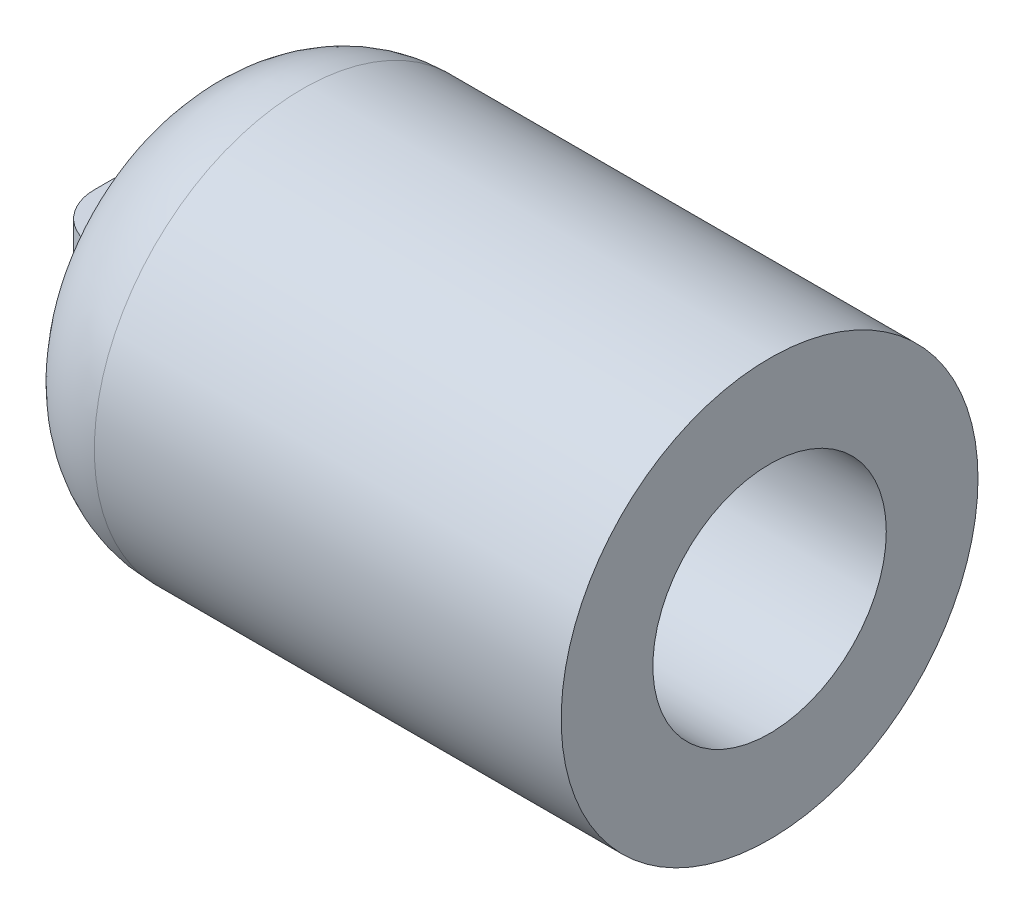
ISO-10303-21;
HEADER;
FILE_DESCRIPTION(('STEP AP214'),'2;1');
FILE_NAME('part.step','',(''),(''),'','','');
FILE_SCHEMA(('AUTOMOTIVE_DESIGN { 1 0 10303 214 1 1 1 1 }'));
ENDSEC;
DATA;
#1=APPLICATION_CONTEXT('core data for automotive mechanical design processes');
#2=APPLICATION_PROTOCOL_DEFINITION('international standard','automotive_design',2000,#1);
#3=PRODUCT_CONTEXT('',#1,'mechanical');
#4=PRODUCT('Part','Part','',(#3));
#5=PRODUCT_RELATED_PRODUCT_CATEGORY('part','',(#4));
#6=PRODUCT_DEFINITION_FORMATION('','',#4);
#7=PRODUCT_DEFINITION_CONTEXT('part definition',#1,'design');
#8=PRODUCT_DEFINITION('design','',#6,#7);
#9=PRODUCT_DEFINITION_SHAPE('','',#8);
#10=(LENGTH_UNIT() NAMED_UNIT(*) SI_UNIT(.MILLI.,.METRE.));
#11=(NAMED_UNIT(*) PLANE_ANGLE_UNIT() SI_UNIT($,.RADIAN.));
#12=(NAMED_UNIT(*) SI_UNIT($,.STERADIAN.) SOLID_ANGLE_UNIT());
#13=UNCERTAINTY_MEASURE_WITH_UNIT(LENGTH_MEASURE(1.E-05),#10,'distance_accuracy_value','');
#14=(GEOMETRIC_REPRESENTATION_CONTEXT(3) GLOBAL_UNCERTAINTY_ASSIGNED_CONTEXT((#13)) GLOBAL_UNIT_ASSIGNED_CONTEXT((#10,
#11,#12)) REPRESENTATION_CONTEXT('',''));
#15=CARTESIAN_POINT('',(0.,0.,0.));
#16=DIRECTION('',(0.,0.,1.));
#17=DIRECTION('',(1.,0.,0.));
#18=AXIS2_PLACEMENT_3D('',#15,#16,#17);
#19=CARTESIAN_POINT('',(-35.,0.,0.));
#20=DIRECTION('',(1.,0.,0.));
#21=DIRECTION('',(0.,0.,-1.));
#22=AXIS2_PLACEMENT_3D('',#19,#20,#21);
#23=CYLINDRICAL_SURFACE('',#22,12.5);
#24=CARTESIAN_POINT('',(-28.,0.,0.));
#25=DIRECTION('',(1.,0.,0.));
#26=DIRECTION('',(0.,0.,-1.));
#27=AXIS2_PLACEMENT_3D('',#24,#25,#26);
#28=CIRCLE('',#27,12.5);
#29=CARTESIAN_POINT('',(-28.,0.,-12.5));
#30=VERTEX_POINT('',#29);
#31=EDGE_CURVE('E49',#30,#30,#28,.T.);
#32=ORIENTED_EDGE('',*,*,#31,.T.);
#33=EDGE_LOOP('',(#32));
#34=FACE_BOUND('',#33,.T.);
#35=CARTESIAN_POINT('',(0.,0.,0.));
#36=DIRECTION('',(1.,0.,0.));
#37=DIRECTION('',(0.,0.,-1.));
#38=AXIS2_PLACEMENT_3D('',#35,#36,#37);
#39=CIRCLE('',#38,12.5);
#40=CARTESIAN_POINT('',(0.,0.,-12.5));
#41=VERTEX_POINT('',#40);
#42=EDGE_CURVE('E133',#41,#41,#39,.T.);
#43=ORIENTED_EDGE('',*,*,#42,.F.);
#44=EDGE_LOOP('',(#43));
#45=FACE_BOUND('',#44,.T.);
#46=ADVANCED_FACE('F40',(#34,#45),#23,.T.);
#47=CARTESIAN_POINT('',(-35.,0.,0.));
#48=DIRECTION('',(1.,0.,0.));
#49=DIRECTION('',(0.,0.,-1.));
#50=AXIS2_PLACEMENT_3D('',#47,#48,#49);
#51=PLANE('',#50);
#52=CARTESIAN_POINT('',(-35.,0.,0.));
#53=DIRECTION('',(1.,0.,0.));
#54=DIRECTION('',(0.,0.,-1.));
#55=AXIS2_PLACEMENT_3D('',#52,#53,#54);
#56=CIRCLE('',#55,5.5);
#57=CARTESIAN_POINT('',(-35.,0.,-5.5));
#58=VERTEX_POINT('',#57);
#59=EDGE_CURVE('E11',#58,#58,#56,.F.);
#60=ORIENTED_EDGE('',*,*,#59,.T.);
#61=EDGE_LOOP('',(#60));
#62=FACE_BOUND('',#61,.T.);
#63=DIRECTION('',(0.,-1.,0.));
#64=VECTOR('',#63,1.);
#65=CARTESIAN_POINT('',(-35.,1.5,3.5));
#66=LINE('',#65,#64);
#67=CARTESIAN_POINT('',(-35.,1.5,3.5));
#68=VERTEX_POINT('',#67);
#69=CARTESIAN_POINT('',(-35.,-1.5,3.5));
#70=VERTEX_POINT('',#69);
#71=EDGE_CURVE('E114',#68,#70,#66,.T.);
#72=ORIENTED_EDGE('',*,*,#71,.T.);
#73=DIRECTION('',(0.,0.,-1.));
#74=VECTOR('',#73,1.);
#75=CARTESIAN_POINT('',(-35.,-1.5,3.5));
#76=LINE('',#75,#74);
#77=CARTESIAN_POINT('',(-35.,-1.5,-3.5));
#78=VERTEX_POINT('',#77);
#79=EDGE_CURVE('E97',#70,#78,#76,.T.);
#80=ORIENTED_EDGE('',*,*,#79,.T.);
#81=DIRECTION('',(0.,-1.,0.));
#82=VECTOR('',#81,1.);
#83=CARTESIAN_POINT('',(-35.,1.5,-3.5));
#84=LINE('',#83,#82);
#85=CARTESIAN_POINT('',(-35.,1.5,-3.5));
#86=VERTEX_POINT('',#85);
#87=EDGE_CURVE('E104',#86,#78,#84,.T.);
#88=ORIENTED_EDGE('',*,*,#87,.F.);
#89=DIRECTION('',(0.,0.,-1.));
#90=VECTOR('',#89,1.);
#91=CARTESIAN_POINT('',(-35.,1.5,3.5));
#92=LINE('',#91,#90);
#93=EDGE_CURVE('E110',#68,#86,#92,.T.);
#94=ORIENTED_EDGE('',*,*,#93,.F.);
#95=EDGE_LOOP('',(#72,#80,#88,#94));
#96=FACE_BOUND('',#95,.T.);
#97=ADVANCED_FACE('F112',(#62,#96),#51,.F.);
#98=CARTESIAN_POINT('',(0.,0.,0.));
#99=DIRECTION('',(1.,0.,0.));
#100=DIRECTION('',(0.,0.,-1.));
#101=AXIS2_PLACEMENT_3D('',#98,#99,#100);
#102=PLANE('',#101);
#103=CARTESIAN_POINT('',(0.,0.,0.));
#104=DIRECTION('',(1.,0.,0.));
#105=DIRECTION('',(0.,0.,-1.));
#106=AXIS2_PLACEMENT_3D('',#103,#104,#105);
#107=CIRCLE('',#106,7.);
#108=CARTESIAN_POINT('',(0.,0.,-7.));
#109=VERTEX_POINT('',#108);
#110=EDGE_CURVE('E228',#109,#109,#107,.T.);
#111=ORIENTED_EDGE('',*,*,#110,.F.);
#112=EDGE_LOOP('',(#111));
#113=FACE_BOUND('',#112,.T.);
#114=ORIENTED_EDGE('',*,*,#42,.T.);
#115=EDGE_LOOP('',(#114));
#116=FACE_BOUND('',#115,.T.);
#117=ADVANCED_FACE('F193',(#113,#116),#102,.T.);
#118=CARTESIAN_POINT('',(-40.,-1.5,3.5));
#119=DIRECTION('',(0.,-1.,0.));
#120=DIRECTION('',(0.,0.,-1.));
#121=AXIS2_PLACEMENT_3D('',#118,#119,#120);
#122=PLANE('',#121);
#123=CARTESIAN_POINT('',(-37.5,-1.5,0.));
#124=DIRECTION('',(0.,-1.,0.));
#125=DIRECTION('',(0.,0.,-1.));
#126=AXIS2_PLACEMENT_3D('',#123,#124,#125);
#127=CIRCLE('',#126,1.5);
#128=CARTESIAN_POINT('',(-37.5,-1.5,-1.5));
#129=VERTEX_POINT('',#128);
#130=EDGE_CURVE('E120',#129,#129,#127,.T.);
#131=ORIENTED_EDGE('',*,*,#130,.F.);
#132=EDGE_LOOP('',(#131));
#133=FACE_BOUND('',#132,.T.);
#134=DIRECTION('',(0.,0.,-1.));
#135=VECTOR('',#134,1.);
#136=CARTESIAN_POINT('',(-40.,-1.5,3.5));
#137=LINE('',#136,#135);
#138=CARTESIAN_POINT('',(-40.,-1.5,0.5));
#139=VERTEX_POINT('',#138);
#140=CARTESIAN_POINT('',(-40.,-1.5,-0.5));
#141=VERTEX_POINT('',#140);
#142=EDGE_CURVE('E129',#139,#141,#137,.T.);
#143=ORIENTED_EDGE('',*,*,#142,.T.);
#144=CARTESIAN_POINT('',(-37.,-1.5,-0.5));
#145=DIRECTION('',(0.,-1.,0.));
#146=DIRECTION('',(0.,0.,-1.));
#147=AXIS2_PLACEMENT_3D('',#144,#145,#146);
#148=CIRCLE('',#147,3.);
#149=CARTESIAN_POINT('',(-37.,-1.5,-3.5));
#150=VERTEX_POINT('',#149);
#151=EDGE_CURVE('E64',#141,#150,#148,.T.);
#152=ORIENTED_EDGE('',*,*,#151,.T.);
#153=DIRECTION('',(1.,0.,0.));
#154=VECTOR('',#153,1.);
#155=CARTESIAN_POINT('',(-40.,-1.5,-3.5));
#156=LINE('',#155,#154);
#157=EDGE_CURVE('E92',#150,#78,#156,.T.);
#158=ORIENTED_EDGE('',*,*,#157,.T.);
#159=ORIENTED_EDGE('',*,*,#79,.F.);
#160=DIRECTION('',(1.,0.,0.));
#161=VECTOR('',#160,1.);
#162=CARTESIAN_POINT('',(-40.,-1.5,3.5));
#163=LINE('',#162,#161);
#164=CARTESIAN_POINT('',(-37.,-1.5,3.5));
#165=VERTEX_POINT('',#164);
#166=EDGE_CURVE('E130',#165,#70,#163,.T.);
#167=ORIENTED_EDGE('',*,*,#166,.F.);
#168=CARTESIAN_POINT('',(-37.,-1.5,0.5));
#169=DIRECTION('',(0.,-1.,0.));
#170=DIRECTION('',(0.,0.,-1.));
#171=AXIS2_PLACEMENT_3D('',#168,#169,#170);
#172=CIRCLE('',#171,3.);
#173=EDGE_CURVE('E146',#165,#139,#172,.T.);
#174=ORIENTED_EDGE('',*,*,#173,.T.);
#175=EDGE_LOOP('',(#143,#152,#158,#159,#167,#174));
#176=FACE_BOUND('',#175,.T.);
#177=ADVANCED_FACE('F94',(#133,#176),#122,.T.);
#178=CARTESIAN_POINT('',(-40.,1.5,3.5));
#179=DIRECTION('',(0.,0.,1.));
#180=DIRECTION('',(1.,0.,0.));
#181=AXIS2_PLACEMENT_3D('',#178,#179,#180);
#182=PLANE('',#181);
#183=DIRECTION('',(1.,0.,0.));
#184=VECTOR('',#183,1.);
#185=CARTESIAN_POINT('',(-40.,1.5,3.5));
#186=LINE('',#185,#184);
#187=CARTESIAN_POINT('',(-37.,1.5,3.5));
#188=VERTEX_POINT('',#187);
#189=EDGE_CURVE('E134',#188,#68,#186,.T.);
#190=ORIENTED_EDGE('',*,*,#189,.F.);
#191=DIRECTION('',(0.,-1.,0.));
#192=VECTOR('',#191,1.);
#193=CARTESIAN_POINT('',(-37.,1.5,3.5));
#194=LINE('',#193,#192);
#195=EDGE_CURVE('E141',#188,#165,#194,.T.);
#196=ORIENTED_EDGE('',*,*,#195,.T.);
#197=ORIENTED_EDGE('',*,*,#166,.T.);
#198=ORIENTED_EDGE('',*,*,#71,.F.);
#199=EDGE_LOOP('',(#190,#196,#197,#198));
#200=FACE_BOUND('',#199,.T.);
#201=ADVANCED_FACE('F216',(#200),#182,.T.);
#202=CARTESIAN_POINT('',(-40.,1.5,3.5));
#203=DIRECTION('',(0.,-1.,0.));
#204=DIRECTION('',(0.,0.,-1.));
#205=AXIS2_PLACEMENT_3D('',#202,#203,#204);
#206=PLANE('',#205);
#207=CARTESIAN_POINT('',(-37.5,1.5,0.));
#208=DIRECTION('',(0.,-1.,0.));
#209=DIRECTION('',(0.,0.,-1.));
#210=AXIS2_PLACEMENT_3D('',#207,#208,#209);
#211=CIRCLE('',#210,1.5);
#212=CARTESIAN_POINT('',(-37.5,1.5,-1.5));
#213=VERTEX_POINT('',#212);
#214=EDGE_CURVE('E116',#213,#213,#211,.T.);
#215=ORIENTED_EDGE('',*,*,#214,.T.);
#216=EDGE_LOOP('',(#215));
#217=FACE_BOUND('',#216,.T.);
#218=DIRECTION('',(1.,0.,0.));
#219=VECTOR('',#218,1.);
#220=CARTESIAN_POINT('',(-40.,1.5,-3.5));
#221=LINE('',#220,#219);
#222=CARTESIAN_POINT('',(-37.,1.5,-3.5));
#223=VERTEX_POINT('',#222);
#224=EDGE_CURVE('E100',#223,#86,#221,.T.);
#225=ORIENTED_EDGE('',*,*,#224,.F.);
#226=CARTESIAN_POINT('',(-37.,1.5,-0.5));
#227=DIRECTION('',(0.,-1.,0.));
#228=DIRECTION('',(0.,0.,-1.));
#229=AXIS2_PLACEMENT_3D('',#226,#227,#228);
#230=CIRCLE('',#229,3.);
#231=CARTESIAN_POINT('',(-40.,1.5,-0.5));
#232=VERTEX_POINT('',#231);
#233=EDGE_CURVE('E163',#223,#232,#230,.F.);
#234=ORIENTED_EDGE('',*,*,#233,.T.);
#235=DIRECTION('',(0.,0.,-1.));
#236=VECTOR('',#235,1.);
#237=CARTESIAN_POINT('',(-40.,1.5,3.5));
#238=LINE('',#237,#236);
#239=CARTESIAN_POINT('',(-40.,1.5,0.5));
#240=VERTEX_POINT('',#239);
#241=EDGE_CURVE('E101',#240,#232,#238,.T.);
#242=ORIENTED_EDGE('',*,*,#241,.F.);
#243=CARTESIAN_POINT('',(-37.,1.5,0.5));
#244=DIRECTION('',(0.,-1.,0.));
#245=DIRECTION('',(0.,0.,-1.));
#246=AXIS2_PLACEMENT_3D('',#243,#244,#245);
#247=CIRCLE('',#246,3.);
#248=EDGE_CURVE('E152',#240,#188,#247,.F.);
#249=ORIENTED_EDGE('',*,*,#248,.T.);
#250=ORIENTED_EDGE('',*,*,#189,.T.);
#251=ORIENTED_EDGE('',*,*,#93,.T.);
#252=EDGE_LOOP('',(#225,#234,#242,#249,#250,#251));
#253=FACE_BOUND('',#252,.T.);
#254=ADVANCED_FACE('F213',(#217,#253),#206,.F.);
#255=CARTESIAN_POINT('',(-40.,1.5,-3.5));
#256=DIRECTION('',(0.,0.,1.));
#257=DIRECTION('',(0.,-1.,0.));
#258=AXIS2_PLACEMENT_3D('',#255,#256,#257);
#259=PLANE('',#258);
#260=ORIENTED_EDGE('',*,*,#157,.F.);
#261=DIRECTION('',(0.,-1.,0.));
#262=VECTOR('',#261,1.);
#263=CARTESIAN_POINT('',(-37.,1.5,-3.5));
#264=LINE('',#263,#262);
#265=EDGE_CURVE('E56',#150,#223,#264,.F.);
#266=ORIENTED_EDGE('',*,*,#265,.T.);
#267=ORIENTED_EDGE('',*,*,#224,.T.);
#268=ORIENTED_EDGE('',*,*,#87,.T.);
#269=EDGE_LOOP('',(#260,#266,#267,#268));
#270=FACE_BOUND('',#269,.T.);
#271=ADVANCED_FACE('F105',(#270),#259,.F.);
#272=CARTESIAN_POINT('',(-40.,0.,0.));
#273=DIRECTION('',(-1.,0.,0.));
#274=DIRECTION('',(0.,0.,1.));
#275=AXIS2_PLACEMENT_3D('',#272,#273,#274);
#276=PLANE('',#275);
#277=ORIENTED_EDGE('',*,*,#241,.T.);
#278=DIRECTION('',(0.,-1.,0.));
#279=VECTOR('',#278,1.);
#280=CARTESIAN_POINT('',(-40.,-1.5,-0.5));
#281=LINE('',#280,#279);
#282=EDGE_CURVE('E155',#232,#141,#281,.T.);
#283=ORIENTED_EDGE('',*,*,#282,.T.);
#284=ORIENTED_EDGE('',*,*,#142,.F.);
#285=DIRECTION('',(0.,-1.,0.));
#286=VECTOR('',#285,1.);
#287=CARTESIAN_POINT('',(-40.,0.,0.5));
#288=LINE('',#287,#286);
#289=EDGE_CURVE('E149',#139,#240,#288,.F.);
#290=ORIENTED_EDGE('',*,*,#289,.T.);
#291=EDGE_LOOP('',(#277,#283,#284,#290));
#292=FACE_BOUND('',#291,.T.);
#293=ADVANCED_FACE('F204',(#292),#276,.T.);
#294=CARTESIAN_POINT('',(-37.5,3.5,0.));
#295=DIRECTION('',(0.,-1.,0.));
#296=DIRECTION('',(0.,0.,-1.));
#297=AXIS2_PLACEMENT_3D('',#294,#295,#296);
#298=CYLINDRICAL_SURFACE('',#297,1.5);
#299=ORIENTED_EDGE('',*,*,#130,.T.);
#300=EDGE_LOOP('',(#299));
#301=FACE_BOUND('',#300,.T.);
#302=ORIENTED_EDGE('',*,*,#214,.F.);
#303=EDGE_LOOP('',(#302));
#304=FACE_BOUND('',#303,.T.);
#305=ADVANCED_FACE('F199',(#301,#304),#298,.F.);
#306=CARTESIAN_POINT('',(-37.,1.5,0.5));
#307=DIRECTION('',(0.,-1.,0.));
#308=DIRECTION('',(0.,0.,-1.));
#309=AXIS2_PLACEMENT_3D('',#306,#307,#308);
#310=CYLINDRICAL_SURFACE('',#309,3.);
#311=ORIENTED_EDGE('',*,*,#248,.F.);
#312=ORIENTED_EDGE('',*,*,#289,.F.);
#313=ORIENTED_EDGE('',*,*,#173,.F.);
#314=ORIENTED_EDGE('',*,*,#195,.F.);
#315=EDGE_LOOP('',(#311,#312,#313,#314));
#316=FACE_BOUND('',#315,.T.);
#317=ADVANCED_FACE('F184',(#316),#310,.T.);
#318=CARTESIAN_POINT('',(-37.,0.,-0.5));
#319=DIRECTION('',(0.,1.,0.));
#320=DIRECTION('',(0.,0.,1.));
#321=AXIS2_PLACEMENT_3D('',#318,#319,#320);
#322=CYLINDRICAL_SURFACE('',#321,3.);
#323=ORIENTED_EDGE('',*,*,#233,.F.);
#324=ORIENTED_EDGE('',*,*,#265,.F.);
#325=ORIENTED_EDGE('',*,*,#151,.F.);
#326=ORIENTED_EDGE('',*,*,#282,.F.);
#327=EDGE_LOOP('',(#323,#324,#325,#326));
#328=FACE_BOUND('',#327,.T.);
#329=ADVANCED_FACE('F173',(#328),#322,.T.);
#330=CARTESIAN_POINT('',(-28.,0.,0.));
#331=DIRECTION('',(1.,0.,0.));
#332=DIRECTION('',(0.,0.,-1.));
#333=AXIS2_PLACEMENT_3D('',#330,#331,#332);
#334=DEGENERATE_TOROIDAL_SURFACE('',#333,5.5,7.,.T.);
#335=ORIENTED_EDGE('',*,*,#59,.F.);
#336=EDGE_LOOP('',(#335));
#337=FACE_BOUND('',#336,.T.);
#338=ORIENTED_EDGE('',*,*,#31,.F.);
#339=EDGE_LOOP('',(#338));
#340=FACE_BOUND('',#339,.T.);
#341=ADVANCED_FACE('F42',(#337,#340),#334,.T.);
#342=CARTESIAN_POINT('',(-30.,0.,0.));
#343=DIRECTION('',(1.,0.,0.));
#344=DIRECTION('',(0.,0.,-1.));
#345=AXIS2_PLACEMENT_3D('',#342,#343,#344);
#346=CYLINDRICAL_SURFACE('',#345,7.);
#347=CARTESIAN_POINT('',(-30.,0.,0.));
#348=DIRECTION('',(1.,0.,0.));
#349=DIRECTION('',(0.,0.,-1.));
#350=AXIS2_PLACEMENT_3D('',#347,#348,#349);
#351=CIRCLE('',#350,7.);
#352=CARTESIAN_POINT('',(-30.,0.,-7.));
#353=VERTEX_POINT('',#352);
#354=EDGE_CURVE('E227',#353,#353,#351,.T.);
#355=ORIENTED_EDGE('',*,*,#354,.F.);
#356=EDGE_LOOP('',(#355));
#357=FACE_BOUND('',#356,.T.);
#358=ORIENTED_EDGE('',*,*,#110,.T.);
#359=EDGE_LOOP('',(#358));
#360=FACE_BOUND('',#359,.T.);
#361=ADVANCED_FACE('F172',(#357,#360),#346,.F.);
#362=CARTESIAN_POINT('',(-30.,0.,0.));
#363=DIRECTION('',(1.,0.,0.));
#364=DIRECTION('',(0.,0.,-1.));
#365=AXIS2_PLACEMENT_3D('',#362,#363,#364);
#366=PLANE('',#365);
#367=ORIENTED_EDGE('',*,*,#354,.T.);
#368=EDGE_LOOP('',(#367));
#369=FACE_BOUND('',#368,.T.);
#370=ADVANCED_FACE('F180',(#369),#366,.T.);
#371=CLOSED_SHELL('',(#46,#97,#117,#177,#201,#254,#271,#293,#305,#317,#329,#341,#361,#370));
#372=MANIFOLD_SOLID_BREP('B2',#371);
#373=ADVANCED_BREP_SHAPE_REPRESENTATION('',(#18,#372),#14);
#374=SHAPE_DEFINITION_REPRESENTATION(#9,#373);
ENDSEC;
END-ISO-10303-21;
